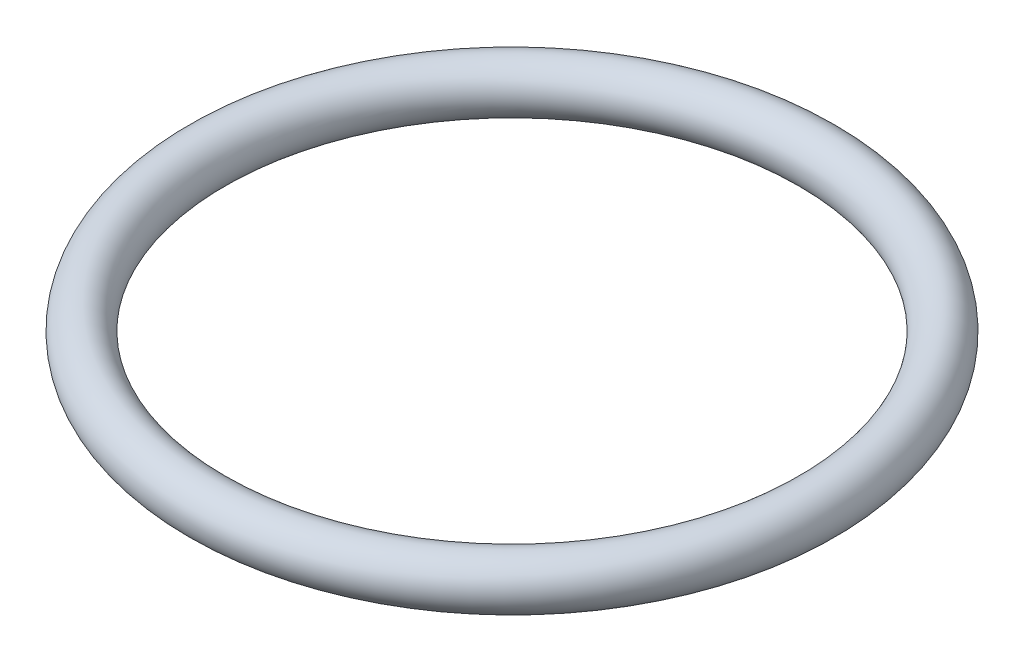
ISO-10303-21;
HEADER;
FILE_DESCRIPTION(('STEP AP214'),'2;1');
FILE_NAME('part.step','',(''),(''),'','','');
FILE_SCHEMA(('AUTOMOTIVE_DESIGN { 1 0 10303 214 1 1 1 1 }'));
ENDSEC;
DATA;
#1=APPLICATION_CONTEXT('core data for automotive mechanical design processes');
#2=APPLICATION_PROTOCOL_DEFINITION('international standard','automotive_design',2000,#1);
#3=PRODUCT_CONTEXT('',#1,'mechanical');
#4=PRODUCT('Part','Part','',(#3));
#5=PRODUCT_RELATED_PRODUCT_CATEGORY('part','',(#4));
#6=PRODUCT_DEFINITION_FORMATION('','',#4);
#7=PRODUCT_DEFINITION_CONTEXT('part definition',#1,'design');
#8=PRODUCT_DEFINITION('design','',#6,#7);
#9=PRODUCT_DEFINITION_SHAPE('','',#8);
#10=(LENGTH_UNIT() NAMED_UNIT(*) SI_UNIT(.MILLI.,.METRE.));
#11=(NAMED_UNIT(*) PLANE_ANGLE_UNIT() SI_UNIT($,.RADIAN.));
#12=(NAMED_UNIT(*) SI_UNIT($,.STERADIAN.) SOLID_ANGLE_UNIT());
#13=UNCERTAINTY_MEASURE_WITH_UNIT(LENGTH_MEASURE(1.E-05),#10,'distance_accuracy_value','');
#14=(GEOMETRIC_REPRESENTATION_CONTEXT(3) GLOBAL_UNCERTAINTY_ASSIGNED_CONTEXT((#13)) GLOBAL_UNIT_ASSIGNED_CONTEXT((#10,
#11,#12)) REPRESENTATION_CONTEXT('',''));
#15=CARTESIAN_POINT('',(0.,0.,0.));
#16=DIRECTION('',(0.,0.,1.));
#17=DIRECTION('',(1.,0.,0.));
#18=AXIS2_PLACEMENT_3D('',#15,#16,#17);
#19=CARTESIAN_POINT('',(0.,0.,0.));
#20=DIRECTION('',(0.,-1.,0.));
#21=DIRECTION('',(0.,0.,-1.));
#22=AXIS2_PLACEMENT_3D('',#19,#20,#21);
#23=TOROIDAL_SURFACE('',#22,8.5,0.7);
#24=CARTESIAN_POINT('',(0.,0.,-9.2));
#25=VERTEX_POINT('',#24);
#26=VERTEX_LOOP('',#25);
#27=FACE_BOUND('',#26,.T.);
#28=ADVANCED_FACE('F35',(#27),#23,.T.);
#29=CLOSED_SHELL('',(#28));
#30=MANIFOLD_SOLID_BREP('B2',#29);
#31=ADVANCED_BREP_SHAPE_REPRESENTATION('',(#18,#30),#14);
#32=SHAPE_DEFINITION_REPRESENTATION(#9,#31);
ENDSEC;
END-ISO-10303-21;
